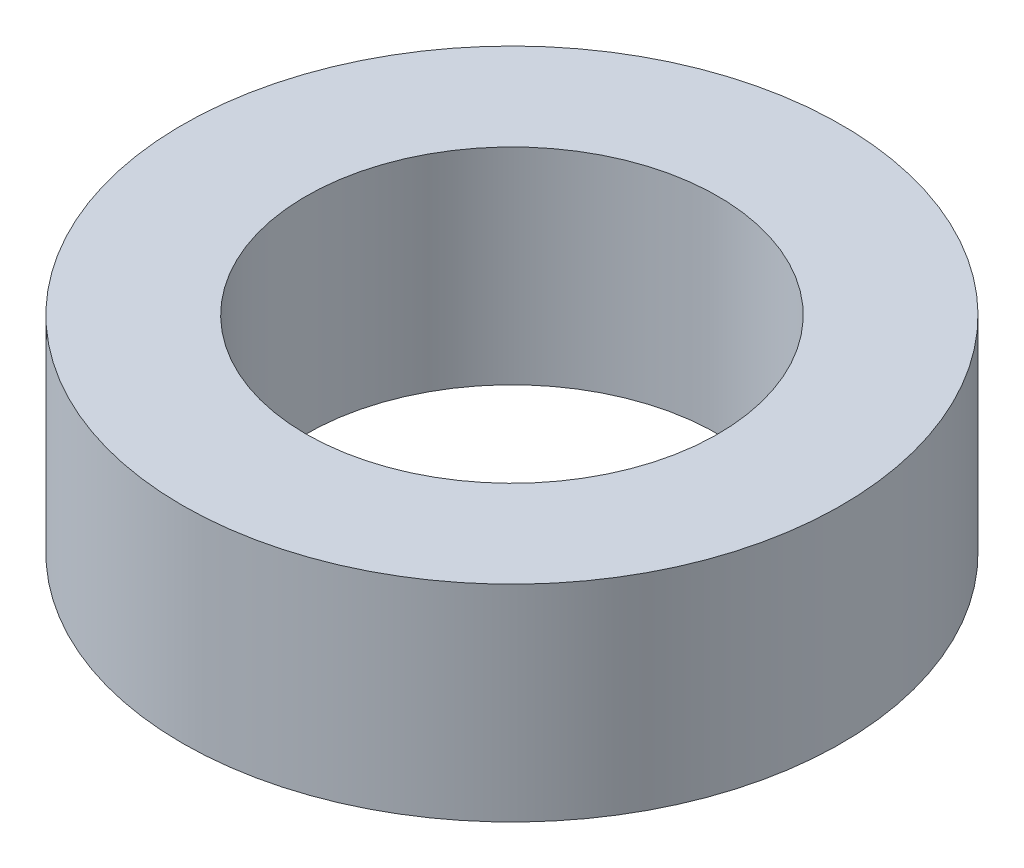
ISO-10303-21;
HEADER;
FILE_DESCRIPTION(('STEP AP214'),'2;1');
FILE_NAME('part.step','',(''),(''),'','','');
FILE_SCHEMA(('AUTOMOTIVE_DESIGN { 1 0 10303 214 1 1 1 1 }'));
ENDSEC;
DATA;
#1=APPLICATION_CONTEXT('core data for automotive mechanical design processes');
#2=APPLICATION_PROTOCOL_DEFINITION('international standard','automotive_design',2000,#1);
#3=PRODUCT_CONTEXT('',#1,'mechanical');
#4=PRODUCT('Part','Part','',(#3));
#5=PRODUCT_RELATED_PRODUCT_CATEGORY('part','',(#4));
#6=PRODUCT_DEFINITION_FORMATION('','',#4);
#7=PRODUCT_DEFINITION_CONTEXT('part definition',#1,'design');
#8=PRODUCT_DEFINITION('design','',#6,#7);
#9=PRODUCT_DEFINITION_SHAPE('','',#8);
#10=(LENGTH_UNIT() NAMED_UNIT(*) SI_UNIT(.MILLI.,.METRE.));
#11=(NAMED_UNIT(*) PLANE_ANGLE_UNIT() SI_UNIT($,.RADIAN.));
#12=(NAMED_UNIT(*) SI_UNIT($,.STERADIAN.) SOLID_ANGLE_UNIT());
#13=UNCERTAINTY_MEASURE_WITH_UNIT(LENGTH_MEASURE(1.E-05),#10,'distance_accuracy_value','');
#14=(GEOMETRIC_REPRESENTATION_CONTEXT(3) GLOBAL_UNCERTAINTY_ASSIGNED_CONTEXT((#13)) GLOBAL_UNIT_ASSIGNED_CONTEXT((#10,
#11,#12)) REPRESENTATION_CONTEXT('',''));
#15=CARTESIAN_POINT('',(0.,0.,0.));
#16=DIRECTION('',(0.,0.,1.));
#17=DIRECTION('',(1.,0.,0.));
#18=AXIS2_PLACEMENT_3D('',#15,#16,#17);
#19=CARTESIAN_POINT('',(0.,2.5,0.));
#20=DIRECTION('',(0.,1.,0.));
#21=DIRECTION('',(0.,0.,1.));
#22=AXIS2_PLACEMENT_3D('',#19,#20,#21);
#23=PLANE('',#22);
#24=CARTESIAN_POINT('',(0.,2.5,0.));
#25=DIRECTION('',(0.,1.,0.));
#26=DIRECTION('',(0.,0.,1.));
#27=AXIS2_PLACEMENT_3D('',#24,#25,#26);
#28=CIRCLE('',#27,4.);
#29=CARTESIAN_POINT('',(0.,2.5,4.));
#30=VERTEX_POINT('',#29);
#31=EDGE_CURVE('E10',#30,#30,#28,.T.);
#32=ORIENTED_EDGE('',*,*,#31,.T.);
#33=EDGE_LOOP('',(#32));
#34=FACE_BOUND('',#33,.T.);
#35=CARTESIAN_POINT('',(0.,2.5,0.));
#36=DIRECTION('',(0.,1.,0.));
#37=DIRECTION('',(0.,0.,1.));
#38=AXIS2_PLACEMENT_3D('',#35,#36,#37);
#39=CIRCLE('',#38,2.5);
#40=CARTESIAN_POINT('',(0.,2.5,2.5));
#41=VERTEX_POINT('',#40);
#42=EDGE_CURVE('E41',#41,#41,#39,.T.);
#43=ORIENTED_EDGE('',*,*,#42,.F.);
#44=EDGE_LOOP('',(#43));
#45=FACE_BOUND('',#44,.T.);
#46=ADVANCED_FACE('F30',(#34,#45),#23,.T.);
#47=CARTESIAN_POINT('',(0.,0.,0.));
#48=DIRECTION('',(0.,1.,0.));
#49=DIRECTION('',(0.,0.,1.));
#50=AXIS2_PLACEMENT_3D('',#47,#48,#49);
#51=PLANE('',#50);
#52=CARTESIAN_POINT('',(0.,0.,0.));
#53=DIRECTION('',(0.,1.,0.));
#54=DIRECTION('',(0.,0.,1.));
#55=AXIS2_PLACEMENT_3D('',#52,#53,#54);
#56=CIRCLE('',#55,4.);
#57=CARTESIAN_POINT('',(0.,0.,4.));
#58=VERTEX_POINT('',#57);
#59=EDGE_CURVE('E34',#58,#58,#56,.T.);
#60=ORIENTED_EDGE('',*,*,#59,.F.);
#61=EDGE_LOOP('',(#60));
#62=FACE_BOUND('',#61,.T.);
#63=CARTESIAN_POINT('',(0.,0.,0.));
#64=DIRECTION('',(0.,1.,0.));
#65=DIRECTION('',(0.,0.,1.));
#66=AXIS2_PLACEMENT_3D('',#63,#64,#65);
#67=CIRCLE('',#66,2.5);
#68=CARTESIAN_POINT('',(0.,0.,2.5));
#69=VERTEX_POINT('',#68);
#70=EDGE_CURVE('E43',#69,#69,#67,.T.);
#71=ORIENTED_EDGE('',*,*,#70,.T.);
#72=EDGE_LOOP('',(#71));
#73=FACE_BOUND('',#72,.T.);
#74=ADVANCED_FACE('F53',(#62,#73),#51,.F.);
#75=CARTESIAN_POINT('',(0.,2.5,0.));
#76=DIRECTION('',(0.,-1.,0.));
#77=DIRECTION('',(0.,0.,-1.));
#78=AXIS2_PLACEMENT_3D('',#75,#76,#77);
#79=CYLINDRICAL_SURFACE('',#78,4.);
#80=ORIENTED_EDGE('',*,*,#31,.F.);
#81=EDGE_LOOP('',(#80));
#82=FACE_BOUND('',#81,.T.);
#83=ORIENTED_EDGE('',*,*,#59,.T.);
#84=EDGE_LOOP('',(#83));
#85=FACE_BOUND('',#84,.T.);
#86=ADVANCED_FACE('F32',(#82,#85),#79,.T.);
#87=CARTESIAN_POINT('',(0.,2.5,0.));
#88=DIRECTION('',(0.,-1.,0.));
#89=DIRECTION('',(0.,0.,-1.));
#90=AXIS2_PLACEMENT_3D('',#87,#88,#89);
#91=CYLINDRICAL_SURFACE('',#90,2.5);
#92=ORIENTED_EDGE('',*,*,#42,.T.);
#93=EDGE_LOOP('',(#92));
#94=FACE_BOUND('',#93,.T.);
#95=ORIENTED_EDGE('',*,*,#70,.F.);
#96=EDGE_LOOP('',(#95));
#97=FACE_BOUND('',#96,.T.);
#98=ADVANCED_FACE('F49',(#94,#97),#91,.F.);
#99=CLOSED_SHELL('',(#46,#74,#86,#98));
#100=MANIFOLD_SOLID_BREP('B2',#99);
#101=ADVANCED_BREP_SHAPE_REPRESENTATION('',(#18,#100),#14);
#102=SHAPE_DEFINITION_REPRESENTATION(#9,#101);
ENDSEC;
END-ISO-10303-21;
